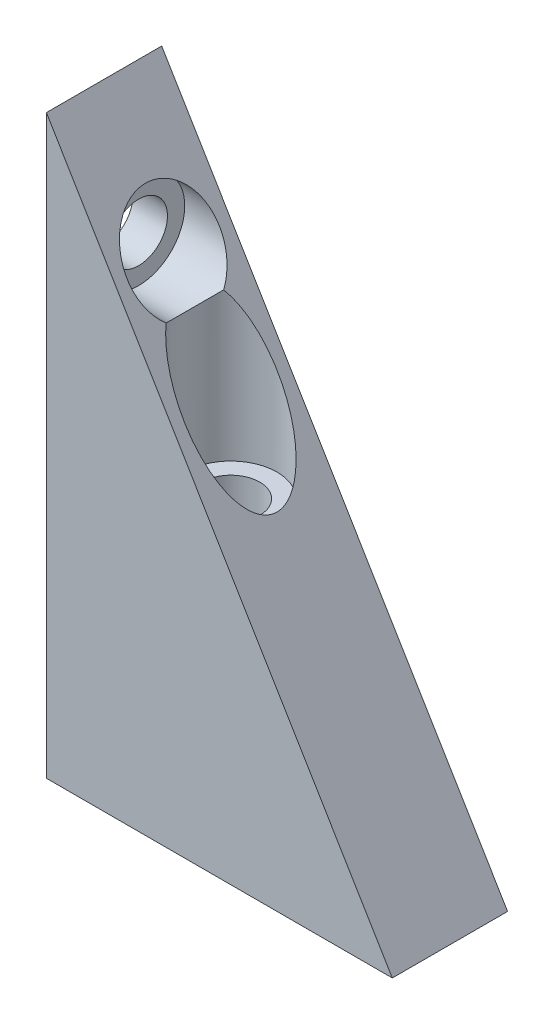
ISO-10303-21;
HEADER;
FILE_DESCRIPTION(('STEP AP214'),'2;1');
FILE_NAME('part.step','',(''),(''),'','','');
FILE_SCHEMA(('AUTOMOTIVE_DESIGN { 1 0 10303 214 1 1 1 1 }'));
ENDSEC;
DATA;
#1=APPLICATION_CONTEXT('core data for automotive mechanical design processes');
#2=APPLICATION_PROTOCOL_DEFINITION('international standard','automotive_design',2000,#1);
#3=PRODUCT_CONTEXT('',#1,'mechanical');
#4=PRODUCT('Part','Part','',(#3));
#5=PRODUCT_RELATED_PRODUCT_CATEGORY('part','',(#4));
#6=PRODUCT_DEFINITION_FORMATION('','',#4);
#7=PRODUCT_DEFINITION_CONTEXT('part definition',#1,'design');
#8=PRODUCT_DEFINITION('design','',#6,#7);
#9=PRODUCT_DEFINITION_SHAPE('','',#8);
#10=(LENGTH_UNIT() NAMED_UNIT(*) SI_UNIT(.MILLI.,.METRE.));
#11=(NAMED_UNIT(*) PLANE_ANGLE_UNIT() SI_UNIT($,.RADIAN.));
#12=(NAMED_UNIT(*) SI_UNIT($,.STERADIAN.) SOLID_ANGLE_UNIT());
#13=UNCERTAINTY_MEASURE_WITH_UNIT(LENGTH_MEASURE(1.E-05),#10,'distance_accuracy_value','');
#14=(GEOMETRIC_REPRESENTATION_CONTEXT(3) GLOBAL_UNCERTAINTY_ASSIGNED_CONTEXT((#13)) GLOBAL_UNIT_ASSIGNED_CONTEXT((#10,
#11,#12)) REPRESENTATION_CONTEXT('',''));
#15=CARTESIAN_POINT('',(0.,0.,0.));
#16=DIRECTION('',(0.,0.,1.));
#17=DIRECTION('',(1.,0.,0.));
#18=AXIS2_PLACEMENT_3D('',#15,#16,#17);
#19=CARTESIAN_POINT('',(11.,24.,5.));
#20=DIRECTION('',(0.,1.,0.));
#21=DIRECTION('',(0.,0.,1.));
#22=AXIS2_PLACEMENT_3D('',#19,#20,#21);
#23=CYLINDRICAL_SURFACE('',#22,4.);
#24=CARTESIAN_POINT('',(11.,24.,5.));
#25=DIRECTION('',(0.,-1.,0.));
#26=DIRECTION('',(0.,0.,-1.));
#27=AXIS2_PLACEMENT_3D('',#24,#25,#26);
#28=CIRCLE('',#27,4.);
#29=CARTESIAN_POINT('',(11.,24.,0.999999999999999));
#30=VERTEX_POINT('',#29);
#31=EDGE_CURVE('E93',#30,#30,#28,.T.);
#32=ORIENTED_EDGE('',*,*,#31,.T.);
#33=EDGE_LOOP('',(#32));
#34=FACE_BOUND('',#33,.T.);
#35=CARTESIAN_POINT('',(11.,31.6666666666667,5.));
#36=DIRECTION('',(-0.857492925712544,-0.514495755427526,0.));
#37=DIRECTION('',(-0.514495755427526,0.857492925712544,0.));
#38=AXIS2_PLACEMENT_3D('',#35,#36,#37);
#39=ELLIPSE('',#38,7.7746025264604,4.);
#40=CARTESIAN_POINT('',(7.875,36.875,7.49687304442978));
#41=VERTEX_POINT('',#40);
#42=CARTESIAN_POINT('',(7.875,36.875,2.50312695557022));
#43=VERTEX_POINT('',#42);
#44=EDGE_CURVE('E89',#41,#43,#39,.F.);
#45=ORIENTED_EDGE('',*,*,#44,.T.);
#46=CARTESIAN_POINT('',(11.,40.,5.));
#47=DIRECTION('',(-0.707106781186548,0.707106781186547,0.));
#48=DIRECTION('',(0.707106781186548,0.707106781186547,0.));
#49=AXIS2_PLACEMENT_3D('',#46,#47,#48);
#50=ELLIPSE('',#49,5.65685424949238,4.);
#51=EDGE_CURVE('E11',#43,#41,#50,.T.);
#52=ORIENTED_EDGE('',*,*,#51,.T.);
#53=EDGE_LOOP('',(#45,#52));
#54=FACE_BOUND('',#53,.T.);
#55=ADVANCED_FACE('F35',(#34,#54),#23,.F.);
#56=CARTESIAN_POINT('',(30.,40.,5.));
#57=DIRECTION('',(-1.,0.,0.));
#58=DIRECTION('',(0.,0.,1.));
#59=AXIS2_PLACEMENT_3D('',#56,#57,#58);
#60=CYLINDRICAL_SURFACE('',#59,2.5);
#61=CARTESIAN_POINT('',(2.99999999999999,40.,5.));
#62=DIRECTION('',(-1.,0.,0.));
#63=DIRECTION('',(0.,0.,1.));
#64=AXIS2_PLACEMENT_3D('',#61,#62,#63);
#65=CIRCLE('',#64,2.5);
#66=CARTESIAN_POINT('',(2.99999999999999,40.,7.5));
#67=VERTEX_POINT('',#66);
#68=EDGE_CURVE('E39',#67,#67,#65,.F.);
#69=ORIENTED_EDGE('',*,*,#68,.T.);
#70=EDGE_LOOP('',(#69));
#71=FACE_BOUND('',#70,.T.);
#72=CARTESIAN_POINT('',(0.,40.,5.));
#73=DIRECTION('',(-1.,0.,0.));
#74=DIRECTION('',(0.,0.,1.));
#75=AXIS2_PLACEMENT_3D('',#72,#73,#74);
#76=CIRCLE('',#75,2.5);
#77=CARTESIAN_POINT('',(0.,40.,7.5));
#78=VERTEX_POINT('',#77);
#79=EDGE_CURVE('E96',#78,#78,#76,.T.);
#80=ORIENTED_EDGE('',*,*,#79,.T.);
#81=EDGE_LOOP('',(#80));
#82=FACE_BOUND('',#81,.T.);
#83=ADVANCED_FACE('F142',(#71,#82),#60,.F.);
#84=CARTESIAN_POINT('',(30.,0.,10.));
#85=DIRECTION('',(0.,1.,0.));
#86=DIRECTION('',(0.,0.,1.));
#87=AXIS2_PLACEMENT_3D('',#84,#85,#86);
#88=PLANE('',#87);
#89=CARTESIAN_POINT('',(11.,0.,5.));
#90=DIRECTION('',(0.,-1.,0.));
#91=DIRECTION('',(0.,0.,-1.));
#92=AXIS2_PLACEMENT_3D('',#89,#90,#91);
#93=CIRCLE('',#92,2.5);
#94=CARTESIAN_POINT('',(11.,0.,2.5));
#95=VERTEX_POINT('',#94);
#96=EDGE_CURVE('E103',#95,#95,#93,.T.);
#97=ORIENTED_EDGE('',*,*,#96,.F.);
#98=EDGE_LOOP('',(#97));
#99=FACE_BOUND('',#98,.T.);
#100=DIRECTION('',(1.,0.,0.));
#101=VECTOR('',#100,1.);
#102=CARTESIAN_POINT('',(30.,0.,0.));
#103=LINE('',#102,#101);
#104=CARTESIAN_POINT('',(0.,0.,0.));
#105=VERTEX_POINT('',#104);
#106=CARTESIAN_POINT('',(30.,0.,0.));
#107=VERTEX_POINT('',#106);
#108=EDGE_CURVE('E106',#105,#107,#103,.T.);
#109=ORIENTED_EDGE('',*,*,#108,.T.);
#110=DIRECTION('',(0.,0.,-1.));
#111=VECTOR('',#110,1.);
#112=CARTESIAN_POINT('',(30.,0.,10.));
#113=LINE('',#112,#111);
#114=CARTESIAN_POINT('',(30.,0.,10.));
#115=VERTEX_POINT('',#114);
#116=EDGE_CURVE('E44',#115,#107,#113,.T.);
#117=ORIENTED_EDGE('',*,*,#116,.F.);
#118=DIRECTION('',(1.,0.,0.));
#119=VECTOR('',#118,1.);
#120=CARTESIAN_POINT('',(30.,0.,10.));
#121=LINE('',#120,#119);
#122=CARTESIAN_POINT('',(0.,0.,10.));
#123=VERTEX_POINT('',#122);
#124=EDGE_CURVE('E107',#123,#115,#121,.T.);
#125=ORIENTED_EDGE('',*,*,#124,.F.);
#126=DIRECTION('',(0.,0.,-1.));
#127=VECTOR('',#126,1.);
#128=CARTESIAN_POINT('',(0.,0.,10.));
#129=LINE('',#128,#127);
#130=EDGE_CURVE('E111',#123,#105,#129,.T.);
#131=ORIENTED_EDGE('',*,*,#130,.T.);
#132=EDGE_LOOP('',(#109,#117,#125,#131));
#133=FACE_BOUND('',#132,.T.);
#134=ADVANCED_FACE('F37',(#99,#133),#88,.F.);
#135=CARTESIAN_POINT('',(0.,50.,10.));
#136=DIRECTION('',(-0.857492925712544,-0.514495755427526,0.));
#137=DIRECTION('',(0.514495755427526,-0.857492925712544,0.));
#138=AXIS2_PLACEMENT_3D('',#135,#136,#137);
#139=PLANE('',#138);
#140=CARTESIAN_POINT('',(6.,40.,5.));
#141=DIRECTION('',(-0.857492925712544,-0.514495755427526,0.));
#142=DIRECTION('',(0.514495755427526,-0.857492925712544,0.));
#143=AXIS2_PLACEMENT_3D('',#140,#141,#142);
#144=ELLIPSE('',#143,4.66476151587624,4.);
#145=EDGE_CURVE('E50',#43,#41,#144,.F.);
#146=ORIENTED_EDGE('',*,*,#145,.F.);
#147=ORIENTED_EDGE('',*,*,#44,.F.);
#148=EDGE_LOOP('',(#146,#147));
#149=FACE_BOUND('',#148,.T.);
#150=DIRECTION('',(-0.514495755427526,0.857492925712544,0.));
#151=VECTOR('',#150,1.);
#152=CARTESIAN_POINT('',(0.,50.,0.));
#153=LINE('',#152,#151);
#154=CARTESIAN_POINT('',(0.,50.,0.));
#155=VERTEX_POINT('',#154);
#156=EDGE_CURVE('E114',#107,#155,#153,.T.);
#157=ORIENTED_EDGE('',*,*,#156,.T.);
#158=DIRECTION('',(0.,0.,-1.));
#159=VECTOR('',#158,1.);
#160=CARTESIAN_POINT('',(0.,50.,10.));
#161=LINE('',#160,#159);
#162=CARTESIAN_POINT('',(0.,50.,10.));
#163=VERTEX_POINT('',#162);
#164=EDGE_CURVE('E118',#163,#155,#161,.T.);
#165=ORIENTED_EDGE('',*,*,#164,.F.);
#166=DIRECTION('',(-0.514495755427526,0.857492925712544,0.));
#167=VECTOR('',#166,1.);
#168=CARTESIAN_POINT('',(0.,50.,10.));
#169=LINE('',#168,#167);
#170=EDGE_CURVE('E81',#115,#163,#169,.T.);
#171=ORIENTED_EDGE('',*,*,#170,.F.);
#172=ORIENTED_EDGE('',*,*,#116,.T.);
#173=EDGE_LOOP('',(#157,#165,#171,#172));
#174=FACE_BOUND('',#173,.T.);
#175=ADVANCED_FACE('F88',(#149,#174),#139,.F.);
#176=CARTESIAN_POINT('',(0.,0.,10.));
#177=DIRECTION('',(1.,0.,0.));
#178=DIRECTION('',(0.,0.,-1.));
#179=AXIS2_PLACEMENT_3D('',#176,#177,#178);
#180=PLANE('',#179);
#181=ORIENTED_EDGE('',*,*,#79,.F.);
#182=EDGE_LOOP('',(#181));
#183=FACE_BOUND('',#182,.T.);
#184=DIRECTION('',(0.,-1.,0.));
#185=VECTOR('',#184,1.);
#186=CARTESIAN_POINT('',(0.,0.,0.));
#187=LINE('',#186,#185);
#188=EDGE_CURVE('E75',#155,#105,#187,.T.);
#189=ORIENTED_EDGE('',*,*,#188,.T.);
#190=ORIENTED_EDGE('',*,*,#130,.F.);
#191=DIRECTION('',(0.,-1.,0.));
#192=VECTOR('',#191,1.);
#193=CARTESIAN_POINT('',(0.,0.,10.));
#194=LINE('',#193,#192);
#195=EDGE_CURVE('E58',#163,#123,#194,.T.);
#196=ORIENTED_EDGE('',*,*,#195,.F.);
#197=ORIENTED_EDGE('',*,*,#164,.T.);
#198=EDGE_LOOP('',(#189,#190,#196,#197));
#199=FACE_BOUND('',#198,.T.);
#200=ADVANCED_FACE('F138',(#183,#199),#180,.F.);
#201=CARTESIAN_POINT('',(0.,0.,10.));
#202=DIRECTION('',(0.,0.,-1.));
#203=DIRECTION('',(-1.,0.,0.));
#204=AXIS2_PLACEMENT_3D('',#201,#202,#203);
#205=PLANE('',#204);
#206=ORIENTED_EDGE('',*,*,#124,.T.);
#207=ORIENTED_EDGE('',*,*,#170,.T.);
#208=ORIENTED_EDGE('',*,*,#195,.T.);
#209=EDGE_LOOP('',(#206,#207,#208));
#210=FACE_BOUND('',#209,.T.);
#211=ADVANCED_FACE('F128',(#210),#205,.F.);
#212=CARTESIAN_POINT('',(0.,0.,0.));
#213=DIRECTION('',(0.,0.,-1.));
#214=DIRECTION('',(-1.,0.,0.));
#215=AXIS2_PLACEMENT_3D('',#212,#213,#214);
#216=PLANE('',#215);
#217=ORIENTED_EDGE('',*,*,#108,.F.);
#218=ORIENTED_EDGE('',*,*,#188,.F.);
#219=ORIENTED_EDGE('',*,*,#156,.F.);
#220=EDGE_LOOP('',(#217,#218,#219));
#221=FACE_BOUND('',#220,.T.);
#222=ADVANCED_FACE('F125',(#221),#216,.T.);
#223=CARTESIAN_POINT('',(11.,50.,5.));
#224=DIRECTION('',(0.,-1.,0.));
#225=DIRECTION('',(0.,0.,-1.));
#226=AXIS2_PLACEMENT_3D('',#223,#224,#225);
#227=CYLINDRICAL_SURFACE('',#226,2.5);
#228=CARTESIAN_POINT('',(11.,24.,5.));
#229=DIRECTION('',(0.,-1.,0.));
#230=DIRECTION('',(0.,0.,-1.));
#231=AXIS2_PLACEMENT_3D('',#228,#229,#230);
#232=CIRCLE('',#231,2.5);
#233=CARTESIAN_POINT('',(11.,24.,2.5));
#234=VERTEX_POINT('',#233);
#235=EDGE_CURVE('E92',#234,#234,#232,.F.);
#236=ORIENTED_EDGE('',*,*,#235,.T.);
#237=EDGE_LOOP('',(#236));
#238=FACE_BOUND('',#237,.T.);
#239=ORIENTED_EDGE('',*,*,#96,.T.);
#240=EDGE_LOOP('',(#239));
#241=FACE_BOUND('',#240,.T.);
#242=ADVANCED_FACE('F127',(#238,#241),#227,.F.);
#243=CARTESIAN_POINT('',(11.,24.,5.));
#244=DIRECTION('',(0.,-1.,0.));
#245=DIRECTION('',(0.,0.,-1.));
#246=AXIS2_PLACEMENT_3D('',#243,#244,#245);
#247=PLANE('',#246);
#248=ORIENTED_EDGE('',*,*,#31,.F.);
#249=EDGE_LOOP('',(#248));
#250=FACE_BOUND('',#249,.T.);
#251=ORIENTED_EDGE('',*,*,#235,.F.);
#252=EDGE_LOOP('',(#251));
#253=FACE_BOUND('',#252,.T.);
#254=ADVANCED_FACE('F135',(#250,#253),#247,.F.);
#255=CARTESIAN_POINT('',(2.99999999999999,40.,5.));
#256=DIRECTION('',(-1.,0.,0.));
#257=DIRECTION('',(0.,0.,1.));
#258=AXIS2_PLACEMENT_3D('',#255,#256,#257);
#259=PLANE('',#258);
#260=CARTESIAN_POINT('',(2.99999999999999,40.,5.));
#261=DIRECTION('',(-1.,0.,0.));
#262=DIRECTION('',(0.,0.,1.));
#263=AXIS2_PLACEMENT_3D('',#260,#261,#262);
#264=CIRCLE('',#263,4.);
#265=CARTESIAN_POINT('',(2.99999999999999,40.,9.));
#266=VERTEX_POINT('',#265);
#267=EDGE_CURVE('E90',#266,#266,#264,.T.);
#268=ORIENTED_EDGE('',*,*,#267,.F.);
#269=EDGE_LOOP('',(#268));
#270=FACE_BOUND('',#269,.T.);
#271=ORIENTED_EDGE('',*,*,#68,.F.);
#272=EDGE_LOOP('',(#271));
#273=FACE_BOUND('',#272,.T.);
#274=ADVANCED_FACE('F154',(#270,#273),#259,.F.);
#275=CARTESIAN_POINT('',(2.99999999999999,40.,5.));
#276=DIRECTION('',(1.,0.,0.));
#277=DIRECTION('',(0.,0.,-1.));
#278=AXIS2_PLACEMENT_3D('',#275,#276,#277);
#279=CYLINDRICAL_SURFACE('',#278,4.);
#280=ORIENTED_EDGE('',*,*,#267,.T.);
#281=EDGE_LOOP('',(#280));
#282=FACE_BOUND('',#281,.T.);
#283=ORIENTED_EDGE('',*,*,#145,.T.);
#284=ORIENTED_EDGE('',*,*,#51,.F.);
#285=EDGE_LOOP('',(#283,#284));
#286=FACE_BOUND('',#285,.T.);
#287=ADVANCED_FACE('F83',(#282,#286),#279,.F.);
#288=CLOSED_SHELL('',(#55,#83,#134,#175,#200,#211,#222,#242,#254,#274,#287));
#289=MANIFOLD_SOLID_BREP('B2',#288);
#290=ADVANCED_BREP_SHAPE_REPRESENTATION('',(#18,#289),#14);
#291=SHAPE_DEFINITION_REPRESENTATION(#9,#290);
ENDSEC;
END-ISO-10303-21;
